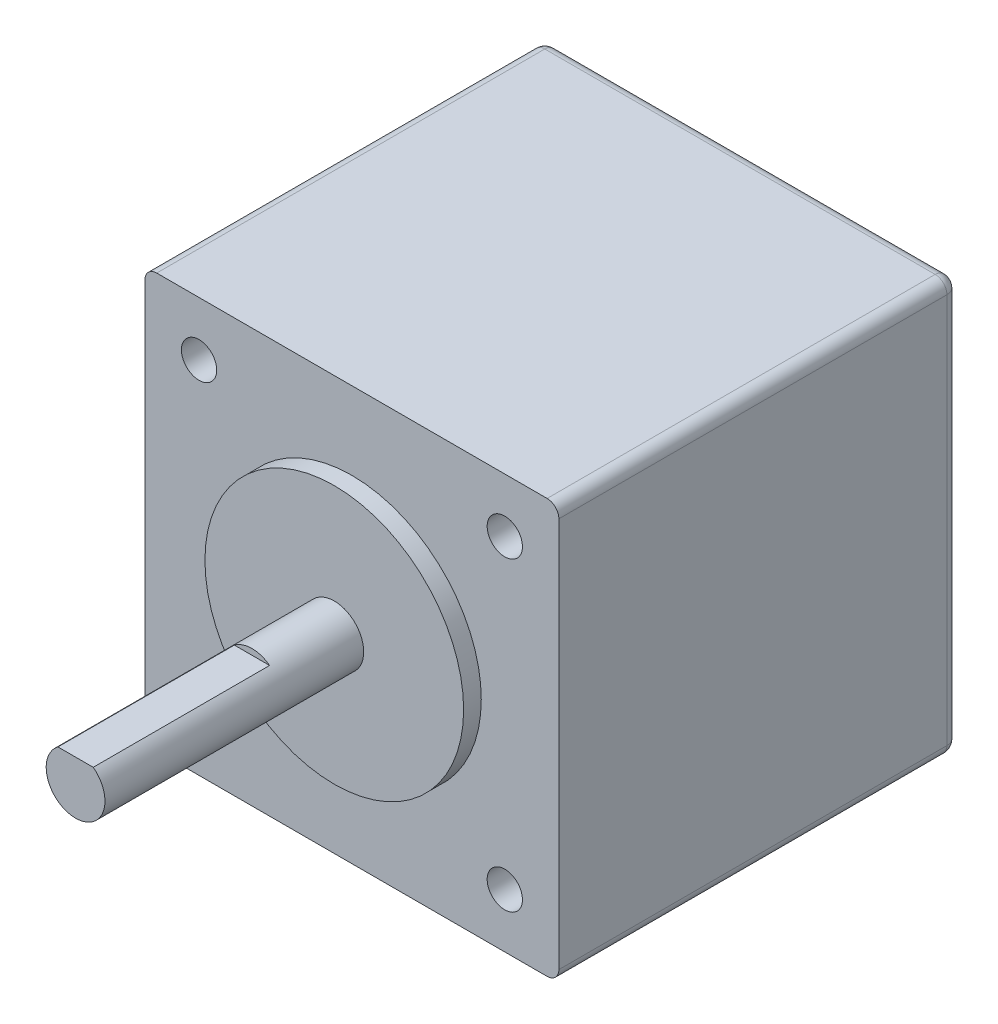
ISO-10303-21;
HEADER;
FILE_DESCRIPTION(('STEP AP214'),'2;1');
FILE_NAME('part.step','',(''),(''),'','','');
FILE_SCHEMA(('AUTOMOTIVE_DESIGN { 1 0 10303 214 1 1 1 1 }'));
ENDSEC;
DATA;
#1=APPLICATION_CONTEXT('core data for automotive mechanical design processes');
#2=APPLICATION_PROTOCOL_DEFINITION('international standard','automotive_design',2000,#1);
#3=PRODUCT_CONTEXT('',#1,'mechanical');
#4=PRODUCT('Part','Part','',(#3));
#5=PRODUCT_RELATED_PRODUCT_CATEGORY('part','',(#4));
#6=PRODUCT_DEFINITION_FORMATION('','',#4);
#7=PRODUCT_DEFINITION_CONTEXT('part definition',#1,'design');
#8=PRODUCT_DEFINITION('design','',#6,#7);
#9=PRODUCT_DEFINITION_SHAPE('','',#8);
#10=(LENGTH_UNIT() NAMED_UNIT(*) SI_UNIT(.MILLI.,.METRE.));
#11=(NAMED_UNIT(*) PLANE_ANGLE_UNIT() SI_UNIT($,.RADIAN.));
#12=(NAMED_UNIT(*) SI_UNIT($,.STERADIAN.) SOLID_ANGLE_UNIT());
#13=UNCERTAINTY_MEASURE_WITH_UNIT(LENGTH_MEASURE(1.E-05),#10,'distance_accuracy_value','');
#14=(GEOMETRIC_REPRESENTATION_CONTEXT(3) GLOBAL_UNCERTAINTY_ASSIGNED_CONTEXT((#13)) GLOBAL_UNIT_ASSIGNED_CONTEXT((#10,
#11,#12)) REPRESENTATION_CONTEXT('',''));
#15=CARTESIAN_POINT('',(0.,0.,0.));
#16=DIRECTION('',(0.,0.,1.));
#17=DIRECTION('',(1.,0.,0.));
#18=AXIS2_PLACEMENT_3D('',#15,#16,#17);
#19=CARTESIAN_POINT('',(0.,0.,35.5));
#20=DIRECTION('',(0.,0.,1.));
#21=DIRECTION('',(1.,0.,0.));
#22=AXIS2_PLACEMENT_3D('',#19,#20,#21);
#23=PLANE('',#22);
#24=CARTESIAN_POINT('',(0.,0.,35.5));
#25=DIRECTION('',(0.,0.,1.));
#26=DIRECTION('',(1.,0.,0.));
#27=AXIS2_PLACEMENT_3D('',#24,#25,#26);
#28=CIRCLE('',#27,11.);
#29=CARTESIAN_POINT('',(11.,0.,35.5));
#30=VERTEX_POINT('',#29);
#31=EDGE_CURVE('E144',#30,#30,#28,.T.);
#32=ORIENTED_EDGE('',*,*,#31,.T.);
#33=EDGE_LOOP('',(#32));
#34=FACE_BOUND('',#33,.T.);
#35=CARTESIAN_POINT('',(0.,0.,35.5));
#36=DIRECTION('',(0.,0.,1.));
#37=DIRECTION('',(1.,0.,0.));
#38=AXIS2_PLACEMENT_3D('',#35,#36,#37);
#39=CIRCLE('',#38,2.5);
#40=CARTESIAN_POINT('',(2.5,0.,35.5));
#41=VERTEX_POINT('',#40);
#42=EDGE_CURVE('E145',#41,#41,#39,.T.);
#43=ORIENTED_EDGE('',*,*,#42,.F.);
#44=EDGE_LOOP('',(#43));
#45=FACE_BOUND('',#44,.T.);
#46=ADVANCED_FACE('F33',(#34,#45),#23,.T.);
#47=CARTESIAN_POINT('',(17.6,17.6,34.));
#48=DIRECTION('',(0.,0.,-1.));
#49=DIRECTION('',(-1.,0.,0.));
#50=AXIS2_PLACEMENT_3D('',#47,#48,#49);
#51=PLANE('',#50);
#52=CARTESIAN_POINT('',(-12.9999999999997,-13.,34.));
#53=DIRECTION('',(0.,0.,1.));
#54=DIRECTION('',(1.,0.,0.));
#55=AXIS2_PLACEMENT_3D('',#52,#53,#54);
#56=CIRCLE('',#55,1.5);
#57=CARTESIAN_POINT('',(-11.4999999999997,-13.,34.));
#58=VERTEX_POINT('',#57);
#59=EDGE_CURVE('E237',#58,#58,#56,.T.);
#60=ORIENTED_EDGE('',*,*,#59,.F.);
#61=EDGE_LOOP('',(#60));
#62=FACE_BOUND('',#61,.T.);
#63=CARTESIAN_POINT('',(13.0000000000003,-12.9999999999997,34.));
#64=DIRECTION('',(0.,0.,1.));
#65=DIRECTION('',(1.,0.,0.));
#66=AXIS2_PLACEMENT_3D('',#63,#64,#65);
#67=CIRCLE('',#66,1.5);
#68=CARTESIAN_POINT('',(14.5000000000003,-12.9999999999997,34.));
#69=VERTEX_POINT('',#68);
#70=EDGE_CURVE('E245',#69,#69,#67,.T.);
#71=ORIENTED_EDGE('',*,*,#70,.F.);
#72=EDGE_LOOP('',(#71));
#73=FACE_BOUND('',#72,.T.);
#74=CARTESIAN_POINT('',(13.,13.0000000000003,34.));
#75=DIRECTION('',(0.,0.,1.));
#76=DIRECTION('',(1.,0.,0.));
#77=AXIS2_PLACEMENT_3D('',#74,#75,#76);
#78=CIRCLE('',#77,1.5);
#79=CARTESIAN_POINT('',(14.5,13.0000000000003,34.));
#80=VERTEX_POINT('',#79);
#81=EDGE_CURVE('E251',#80,#80,#78,.T.);
#82=ORIENTED_EDGE('',*,*,#81,.F.);
#83=EDGE_LOOP('',(#82));
#84=FACE_BOUND('',#83,.T.);
#85=CARTESIAN_POINT('',(-13.,13.,34.));
#86=DIRECTION('',(0.,0.,1.));
#87=DIRECTION('',(1.,0.,0.));
#88=AXIS2_PLACEMENT_3D('',#85,#86,#87);
#89=CIRCLE('',#88,1.5);
#90=CARTESIAN_POINT('',(-11.5,13.,34.));
#91=VERTEX_POINT('',#90);
#92=EDGE_CURVE('E257',#91,#91,#89,.T.);
#93=ORIENTED_EDGE('',*,*,#92,.F.);
#94=EDGE_LOOP('',(#93));
#95=FACE_BOUND('',#94,.T.);
#96=DIRECTION('',(0.,-1.,0.));
#97=VECTOR('',#96,1.);
#98=CARTESIAN_POINT('',(-17.6,-17.6,34.));
#99=LINE('',#98,#97);
#100=CARTESIAN_POINT('',(-17.6,16.6,34.));
#101=VERTEX_POINT('',#100);
#102=CARTESIAN_POINT('',(-17.6,-16.6,34.));
#103=VERTEX_POINT('',#102);
#104=EDGE_CURVE('E159',#101,#103,#99,.T.);
#105=ORIENTED_EDGE('',*,*,#104,.T.);
#106=CARTESIAN_POINT('',(-16.6,-16.6,34.));
#107=DIRECTION('',(0.,0.,-1.));
#108=DIRECTION('',(-1.,0.,0.));
#109=AXIS2_PLACEMENT_3D('',#106,#107,#108);
#110=CIRCLE('',#109,1.);
#111=CARTESIAN_POINT('',(-16.6,-17.6,34.));
#112=VERTEX_POINT('',#111);
#113=EDGE_CURVE('E11',#103,#112,#110,.F.);
#114=ORIENTED_EDGE('',*,*,#113,.T.);
#115=DIRECTION('',(1.,0.,0.));
#116=VECTOR('',#115,1.);
#117=CARTESIAN_POINT('',(-17.6,-17.6,34.));
#118=LINE('',#117,#116);
#119=CARTESIAN_POINT('',(16.6,-17.6,34.));
#120=VERTEX_POINT('',#119);
#121=EDGE_CURVE('E162',#112,#120,#118,.T.);
#122=ORIENTED_EDGE('',*,*,#121,.T.);
#123=CARTESIAN_POINT('',(16.6,-16.6,34.));
#124=DIRECTION('',(0.,0.,-1.));
#125=DIRECTION('',(-1.,0.,0.));
#126=AXIS2_PLACEMENT_3D('',#123,#124,#125);
#127=CIRCLE('',#126,1.);
#128=CARTESIAN_POINT('',(17.6,-16.6,34.));
#129=VERTEX_POINT('',#128);
#130=EDGE_CURVE('E42',#120,#129,#127,.F.);
#131=ORIENTED_EDGE('',*,*,#130,.T.);
#132=DIRECTION('',(0.,1.,0.));
#133=VECTOR('',#132,1.);
#134=CARTESIAN_POINT('',(17.6,-17.6,34.));
#135=LINE('',#134,#133);
#136=CARTESIAN_POINT('',(17.6,16.6,34.));
#137=VERTEX_POINT('',#136);
#138=EDGE_CURVE('E148',#129,#137,#135,.T.);
#139=ORIENTED_EDGE('',*,*,#138,.T.);
#140=CARTESIAN_POINT('',(16.6,16.6,34.));
#141=DIRECTION('',(0.,0.,-1.));
#142=DIRECTION('',(-1.,0.,0.));
#143=AXIS2_PLACEMENT_3D('',#140,#141,#142);
#144=CIRCLE('',#143,1.);
#145=CARTESIAN_POINT('',(16.6,17.6,34.));
#146=VERTEX_POINT('',#145);
#147=EDGE_CURVE('E200',#137,#146,#144,.F.);
#148=ORIENTED_EDGE('',*,*,#147,.T.);
#149=DIRECTION('',(-1.,0.,0.));
#150=VECTOR('',#149,1.);
#151=CARTESIAN_POINT('',(-17.6,17.6,34.));
#152=LINE('',#151,#150);
#153=CARTESIAN_POINT('',(-16.6,17.6,34.));
#154=VERTEX_POINT('',#153);
#155=EDGE_CURVE('E156',#146,#154,#152,.T.);
#156=ORIENTED_EDGE('',*,*,#155,.T.);
#157=CARTESIAN_POINT('',(-16.6,16.6,34.));
#158=DIRECTION('',(0.,0.,-1.));
#159=DIRECTION('',(-1.,0.,0.));
#160=AXIS2_PLACEMENT_3D('',#157,#158,#159);
#161=CIRCLE('',#160,1.);
#162=EDGE_CURVE('E202',#154,#101,#161,.F.);
#163=ORIENTED_EDGE('',*,*,#162,.T.);
#164=EDGE_LOOP('',(#105,#114,#122,#131,#139,#148,#156,#163));
#165=FACE_BOUND('',#164,.T.);
#166=CARTESIAN_POINT('',(0.,0.,34.));
#167=DIRECTION('',(0.,0.,-1.));
#168=DIRECTION('',(-1.,0.,0.));
#169=AXIS2_PLACEMENT_3D('',#166,#167,#168);
#170=CIRCLE('',#169,11.);
#171=CARTESIAN_POINT('',(-11.,0.,34.));
#172=VERTEX_POINT('',#171);
#173=EDGE_CURVE('E134',#172,#172,#170,.F.);
#174=ORIENTED_EDGE('',*,*,#173,.F.);
#175=EDGE_LOOP('',(#174));
#176=FACE_BOUND('',#175,.T.);
#177=ADVANCED_FACE('F278',(#62,#73,#84,#95,#165,#176),#51,.F.);
#178=CARTESIAN_POINT('',(17.6,-17.6,34.));
#179=DIRECTION('',(-1.,0.,0.));
#180=DIRECTION('',(0.,0.,1.));
#181=AXIS2_PLACEMENT_3D('',#178,#179,#180);
#182=PLANE('',#181);
#183=ORIENTED_EDGE('',*,*,#138,.F.);
#184=DIRECTION('',(0.,0.,-1.));
#185=VECTOR('',#184,1.);
#186=CARTESIAN_POINT('',(17.6,-16.6,34.));
#187=LINE('',#186,#185);
#188=CARTESIAN_POINT('',(17.6,-16.6,1.));
#189=VERTEX_POINT('',#188);
#190=EDGE_CURVE('E50',#129,#189,#187,.T.);
#191=ORIENTED_EDGE('',*,*,#190,.T.);
#192=DIRECTION('',(0.,1.,0.));
#193=VECTOR('',#192,1.);
#194=CARTESIAN_POINT('',(17.6,17.6,1.));
#195=LINE('',#194,#193);
#196=CARTESIAN_POINT('',(17.6,16.6,1.));
#197=VERTEX_POINT('',#196);
#198=EDGE_CURVE('E55',#189,#197,#195,.T.);
#199=ORIENTED_EDGE('',*,*,#198,.T.);
#200=DIRECTION('',(0.,0.,-1.));
#201=VECTOR('',#200,1.);
#202=CARTESIAN_POINT('',(17.6,16.6,34.));
#203=LINE('',#202,#201);
#204=EDGE_CURVE('E196',#197,#137,#203,.F.);
#205=ORIENTED_EDGE('',*,*,#204,.T.);
#206=EDGE_LOOP('',(#183,#191,#199,#205));
#207=FACE_BOUND('',#206,.T.);
#208=ADVANCED_FACE('F284',(#207),#182,.F.);
#209=CARTESIAN_POINT('',(-17.6,17.6,34.));
#210=DIRECTION('',(0.,-1.,0.));
#211=DIRECTION('',(0.,0.,-1.));
#212=AXIS2_PLACEMENT_3D('',#209,#210,#211);
#213=PLANE('',#212);
#214=DIRECTION('',(-1.,0.,0.));
#215=VECTOR('',#214,1.);
#216=CARTESIAN_POINT('',(-17.6,17.6,1.));
#217=LINE('',#216,#215);
#218=CARTESIAN_POINT('',(16.6,17.6,1.));
#219=VERTEX_POINT('',#218);
#220=CARTESIAN_POINT('',(-16.6,17.6,1.));
#221=VERTEX_POINT('',#220);
#222=EDGE_CURVE('E170',#219,#221,#217,.T.);
#223=ORIENTED_EDGE('',*,*,#222,.T.);
#224=DIRECTION('',(0.,0.,-1.));
#225=VECTOR('',#224,1.);
#226=CARTESIAN_POINT('',(-16.6,17.6,34.));
#227=LINE('',#226,#225);
#228=EDGE_CURVE('E173',#221,#154,#227,.F.);
#229=ORIENTED_EDGE('',*,*,#228,.T.);
#230=ORIENTED_EDGE('',*,*,#155,.F.);
#231=DIRECTION('',(0.,0.,-1.));
#232=VECTOR('',#231,1.);
#233=CARTESIAN_POINT('',(16.6,17.6,34.));
#234=LINE('',#233,#232);
#235=EDGE_CURVE('E168',#146,#219,#234,.T.);
#236=ORIENTED_EDGE('',*,*,#235,.T.);
#237=EDGE_LOOP('',(#223,#229,#230,#236));
#238=FACE_BOUND('',#237,.T.);
#239=ADVANCED_FACE('F305',(#238),#213,.F.);
#240=CARTESIAN_POINT('',(-17.6,-17.6,34.));
#241=DIRECTION('',(1.,0.,0.));
#242=DIRECTION('',(0.,0.,-1.));
#243=AXIS2_PLACEMENT_3D('',#240,#241,#242);
#244=PLANE('',#243);
#245=DIRECTION('',(0.,-1.,0.));
#246=VECTOR('',#245,1.);
#247=CARTESIAN_POINT('',(-17.6,-17.6,1.));
#248=LINE('',#247,#246);
#249=CARTESIAN_POINT('',(-17.6,16.6,1.));
#250=VERTEX_POINT('',#249);
#251=CARTESIAN_POINT('',(-17.6,-16.6,1.));
#252=VERTEX_POINT('',#251);
#253=EDGE_CURVE('E186',#250,#252,#248,.T.);
#254=ORIENTED_EDGE('',*,*,#253,.T.);
#255=DIRECTION('',(0.,0.,-1.));
#256=VECTOR('',#255,1.);
#257=CARTESIAN_POINT('',(-17.6,-16.6,34.));
#258=LINE('',#257,#256);
#259=EDGE_CURVE('E188',#252,#103,#258,.F.);
#260=ORIENTED_EDGE('',*,*,#259,.T.);
#261=ORIENTED_EDGE('',*,*,#104,.F.);
#262=DIRECTION('',(0.,0.,-1.));
#263=VECTOR('',#262,1.);
#264=CARTESIAN_POINT('',(-17.6,16.6,34.));
#265=LINE('',#264,#263);
#266=EDGE_CURVE('E184',#101,#250,#265,.T.);
#267=ORIENTED_EDGE('',*,*,#266,.T.);
#268=EDGE_LOOP('',(#254,#260,#261,#267));
#269=FACE_BOUND('',#268,.T.);
#270=ADVANCED_FACE('F301',(#269),#244,.F.);
#271=CARTESIAN_POINT('',(-17.6,-17.6,34.));
#272=DIRECTION('',(0.,1.,0.));
#273=DIRECTION('',(0.,0.,1.));
#274=AXIS2_PLACEMENT_3D('',#271,#272,#273);
#275=PLANE('',#274);
#276=ORIENTED_EDGE('',*,*,#121,.F.);
#277=DIRECTION('',(0.,0.,-1.));
#278=VECTOR('',#277,1.);
#279=CARTESIAN_POINT('',(-16.6,-17.6,34.));
#280=LINE('',#279,#278);
#281=CARTESIAN_POINT('',(-16.6,-17.6,1.));
#282=VERTEX_POINT('',#281);
#283=EDGE_CURVE('E194',#112,#282,#280,.T.);
#284=ORIENTED_EDGE('',*,*,#283,.T.);
#285=DIRECTION('',(1.,0.,0.));
#286=VECTOR('',#285,1.);
#287=CARTESIAN_POINT('',(17.6,-17.6,1.));
#288=LINE('',#287,#286);
#289=CARTESIAN_POINT('',(16.6,-17.6,1.));
#290=VERTEX_POINT('',#289);
#291=EDGE_CURVE('E192',#282,#290,#288,.T.);
#292=ORIENTED_EDGE('',*,*,#291,.T.);
#293=DIRECTION('',(0.,0.,-1.));
#294=VECTOR('',#293,1.);
#295=CARTESIAN_POINT('',(16.6,-17.6,34.));
#296=LINE('',#295,#294);
#297=EDGE_CURVE('E190',#290,#120,#296,.F.);
#298=ORIENTED_EDGE('',*,*,#297,.T.);
#299=EDGE_LOOP('',(#276,#284,#292,#298));
#300=FACE_BOUND('',#299,.T.);
#301=ADVANCED_FACE('F297',(#300),#275,.F.);
#302=CARTESIAN_POINT('',(17.6,17.6,0.));
#303=DIRECTION('',(0.,0.,-1.));
#304=DIRECTION('',(-1.,0.,0.));
#305=AXIS2_PLACEMENT_3D('',#302,#303,#304);
#306=PLANE('',#305);
#307=DIRECTION('',(0.,-1.,0.));
#308=VECTOR('',#307,1.);
#309=CARTESIAN_POINT('',(-16.6,17.6,0.));
#310=LINE('',#309,#308);
#311=CARTESIAN_POINT('',(-16.6,-16.6,0.));
#312=VERTEX_POINT('',#311);
#313=CARTESIAN_POINT('',(-16.6,16.6,0.));
#314=VERTEX_POINT('',#313);
#315=EDGE_CURVE('E179',#312,#314,#310,.F.);
#316=ORIENTED_EDGE('',*,*,#315,.T.);
#317=DIRECTION('',(-1.,0.,0.));
#318=VECTOR('',#317,1.);
#319=CARTESIAN_POINT('',(17.6,16.6,0.));
#320=LINE('',#319,#318);
#321=CARTESIAN_POINT('',(16.6,16.6,0.));
#322=VERTEX_POINT('',#321);
#323=EDGE_CURVE('E181',#314,#322,#320,.F.);
#324=ORIENTED_EDGE('',*,*,#323,.T.);
#325=DIRECTION('',(0.,1.,0.));
#326=VECTOR('',#325,1.);
#327=CARTESIAN_POINT('',(16.6,-17.6,0.));
#328=LINE('',#327,#326);
#329=CARTESIAN_POINT('',(16.6,-16.6,0.));
#330=VERTEX_POINT('',#329);
#331=EDGE_CURVE('E175',#322,#330,#328,.F.);
#332=ORIENTED_EDGE('',*,*,#331,.T.);
#333=DIRECTION('',(1.,0.,0.));
#334=VECTOR('',#333,1.);
#335=CARTESIAN_POINT('',(-17.6,-16.6,0.));
#336=LINE('',#335,#334);
#337=EDGE_CURVE('E177',#330,#312,#336,.F.);
#338=ORIENTED_EDGE('',*,*,#337,.T.);
#339=EDGE_LOOP('',(#316,#324,#332,#338));
#340=FACE_BOUND('',#339,.T.);
#341=ADVANCED_FACE('F292',(#340),#306,.T.);
#342=CARTESIAN_POINT('',(0.,0.,35.5));
#343=DIRECTION('',(0.,0.,-1.));
#344=DIRECTION('',(-1.,0.,0.));
#345=AXIS2_PLACEMENT_3D('',#342,#343,#344);
#346=CYLINDRICAL_SURFACE('',#345,11.);
#347=ORIENTED_EDGE('',*,*,#31,.F.);
#348=EDGE_LOOP('',(#347));
#349=FACE_BOUND('',#348,.T.);
#350=ORIENTED_EDGE('',*,*,#173,.T.);
#351=EDGE_LOOP('',(#350));
#352=FACE_BOUND('',#351,.T.);
#353=ADVANCED_FACE('F290',(#349,#352),#346,.T.);
#354=CARTESIAN_POINT('',(0.,0.,57.5));
#355=DIRECTION('',(0.,0.,-1.));
#356=DIRECTION('',(-1.,0.,0.));
#357=AXIS2_PLACEMENT_3D('',#354,#355,#356);
#358=CYLINDRICAL_SURFACE('',#357,2.5);
#359=CARTESIAN_POINT('',(0.,0.,57.5));
#360=DIRECTION('',(0.,0.,1.));
#361=DIRECTION('',(1.,0.,0.));
#362=AXIS2_PLACEMENT_3D('',#359,#360,#361);
#363=CIRCLE('',#362,2.5);
#364=CARTESIAN_POINT('',(-1.5,2.,57.5));
#365=VERTEX_POINT('',#364);
#366=CARTESIAN_POINT('',(1.5,2.,57.5));
#367=VERTEX_POINT('',#366);
#368=EDGE_CURVE('E140',#365,#367,#363,.T.);
#369=ORIENTED_EDGE('',*,*,#368,.F.);
#370=DIRECTION('',(0.,0.,-1.));
#371=VECTOR('',#370,1.);
#372=CARTESIAN_POINT('',(-1.5,2.,57.5));
#373=LINE('',#372,#371);
#374=CARTESIAN_POINT('',(-1.5,2.,42.5));
#375=VERTEX_POINT('',#374);
#376=EDGE_CURVE('E129',#365,#375,#373,.T.);
#377=ORIENTED_EDGE('',*,*,#376,.T.);
#378=CARTESIAN_POINT('',(0.,0.,42.5));
#379=DIRECTION('',(0.,0.,-1.));
#380=DIRECTION('',(-1.,0.,0.));
#381=AXIS2_PLACEMENT_3D('',#378,#379,#380);
#382=CIRCLE('',#381,2.5);
#383=CARTESIAN_POINT('',(1.5,2.,42.5));
#384=VERTEX_POINT('',#383);
#385=EDGE_CURVE('E133',#375,#384,#382,.T.);
#386=ORIENTED_EDGE('',*,*,#385,.T.);
#387=DIRECTION('',(0.,0.,-1.));
#388=VECTOR('',#387,1.);
#389=CARTESIAN_POINT('',(1.5,2.,57.5));
#390=LINE('',#389,#388);
#391=EDGE_CURVE('E126',#384,#367,#390,.F.);
#392=ORIENTED_EDGE('',*,*,#391,.T.);
#393=EDGE_LOOP('',(#369,#377,#386,#392));
#394=FACE_BOUND('',#393,.T.);
#395=ORIENTED_EDGE('',*,*,#42,.T.);
#396=EDGE_LOOP('',(#395));
#397=FACE_BOUND('',#396,.T.);
#398=ADVANCED_FACE('F138',(#394,#397),#358,.T.);
#399=CARTESIAN_POINT('',(0.,0.,57.5));
#400=DIRECTION('',(0.,0.,1.));
#401=DIRECTION('',(1.,0.,0.));
#402=AXIS2_PLACEMENT_3D('',#399,#400,#401);
#403=PLANE('',#402);
#404=DIRECTION('',(1.,0.,0.));
#405=VECTOR('',#404,1.);
#406=CARTESIAN_POINT('',(0.,2.,57.5));
#407=LINE('',#406,#405);
#408=EDGE_CURVE('E122',#365,#367,#407,.T.);
#409=ORIENTED_EDGE('',*,*,#408,.F.);
#410=ORIENTED_EDGE('',*,*,#368,.T.);
#411=EDGE_LOOP('',(#409,#410));
#412=FACE_BOUND('',#411,.T.);
#413=ADVANCED_FACE('F143',(#412),#403,.T.);
#414=CARTESIAN_POINT('',(-5.,2.5,42.5));
#415=DIRECTION('',(0.,0.,-1.));
#416=DIRECTION('',(-1.,0.,0.));
#417=AXIS2_PLACEMENT_3D('',#414,#415,#416);
#418=PLANE('',#417);
#419=DIRECTION('',(1.,0.,0.));
#420=VECTOR('',#419,1.);
#421=CARTESIAN_POINT('',(-5.,2.,42.5));
#422=LINE('',#421,#420);
#423=EDGE_CURVE('E141',#375,#384,#422,.T.);
#424=ORIENTED_EDGE('',*,*,#423,.T.);
#425=ORIENTED_EDGE('',*,*,#385,.F.);
#426=EDGE_LOOP('',(#424,#425));
#427=FACE_BOUND('',#426,.T.);
#428=ADVANCED_FACE('F266',(#427),#418,.F.);
#429=CARTESIAN_POINT('',(-5.,2.,57.5));
#430=DIRECTION('',(0.,-1.,0.));
#431=DIRECTION('',(0.,0.,-1.));
#432=AXIS2_PLACEMENT_3D('',#429,#430,#431);
#433=PLANE('',#432);
#434=ORIENTED_EDGE('',*,*,#408,.T.);
#435=ORIENTED_EDGE('',*,*,#391,.F.);
#436=ORIENTED_EDGE('',*,*,#423,.F.);
#437=ORIENTED_EDGE('',*,*,#376,.F.);
#438=EDGE_LOOP('',(#434,#435,#436,#437));
#439=FACE_BOUND('',#438,.T.);
#440=ADVANCED_FACE('F124',(#439),#433,.F.);
#441=CARTESIAN_POINT('',(-13.,13.,29.5));
#442=DIRECTION('',(0.,0.,1.));
#443=DIRECTION('',(1.,0.,0.));
#444=AXIS2_PLACEMENT_3D('',#441,#442,#443);
#445=CYLINDRICAL_SURFACE('',#444,1.5);
#446=CARTESIAN_POINT('',(-13.,13.,29.5));
#447=DIRECTION('',(0.,0.,1.));
#448=DIRECTION('',(1.,0.,0.));
#449=AXIS2_PLACEMENT_3D('',#446,#447,#448);
#450=CIRCLE('',#449,1.5);
#451=CARTESIAN_POINT('',(-11.5,13.,29.5));
#452=VERTEX_POINT('',#451);
#453=EDGE_CURVE('E260',#452,#452,#450,.T.);
#454=ORIENTED_EDGE('',*,*,#453,.F.);
#455=EDGE_LOOP('',(#454));
#456=FACE_BOUND('',#455,.T.);
#457=ORIENTED_EDGE('',*,*,#92,.T.);
#458=EDGE_LOOP('',(#457));
#459=FACE_BOUND('',#458,.T.);
#460=ADVANCED_FACE('F273',(#456,#459),#445,.F.);
#461=CARTESIAN_POINT('',(-13.,13.,29.5));
#462=DIRECTION('',(0.,0.,1.));
#463=DIRECTION('',(1.,0.,0.));
#464=AXIS2_PLACEMENT_3D('',#461,#462,#463);
#465=PLANE('',#464);
#466=ORIENTED_EDGE('',*,*,#453,.T.);
#467=EDGE_LOOP('',(#466));
#468=FACE_BOUND('',#467,.T.);
#469=ADVANCED_FACE('F418',(#468),#465,.T.);
#470=CARTESIAN_POINT('',(13.,13.0000000000003,29.5));
#471=DIRECTION('',(0.,0.,1.));
#472=DIRECTION('',(1.,0.,0.));
#473=AXIS2_PLACEMENT_3D('',#470,#471,#472);
#474=CYLINDRICAL_SURFACE('',#473,1.5);
#475=CARTESIAN_POINT('',(13.,13.0000000000003,29.5));
#476=DIRECTION('',(0.,0.,1.));
#477=DIRECTION('',(1.,0.,0.));
#478=AXIS2_PLACEMENT_3D('',#475,#476,#477);
#479=CIRCLE('',#478,1.5);
#480=CARTESIAN_POINT('',(14.5,13.0000000000003,29.5));
#481=VERTEX_POINT('',#480);
#482=EDGE_CURVE('E254',#481,#481,#479,.T.);
#483=ORIENTED_EDGE('',*,*,#482,.F.);
#484=EDGE_LOOP('',(#483));
#485=FACE_BOUND('',#484,.T.);
#486=ORIENTED_EDGE('',*,*,#81,.T.);
#487=EDGE_LOOP('',(#486));
#488=FACE_BOUND('',#487,.T.);
#489=ADVANCED_FACE('F414',(#485,#488),#474,.F.);
#490=CARTESIAN_POINT('',(13.,13.0000000000003,29.5));
#491=DIRECTION('',(0.,0.,1.));
#492=DIRECTION('',(1.,0.,0.));
#493=AXIS2_PLACEMENT_3D('',#490,#491,#492);
#494=PLANE('',#493);
#495=ORIENTED_EDGE('',*,*,#482,.T.);
#496=EDGE_LOOP('',(#495));
#497=FACE_BOUND('',#496,.T.);
#498=ADVANCED_FACE('F410',(#497),#494,.T.);
#499=CARTESIAN_POINT('',(13.0000000000003,-12.9999999999997,29.5));
#500=DIRECTION('',(0.,0.,1.));
#501=DIRECTION('',(1.,0.,0.));
#502=AXIS2_PLACEMENT_3D('',#499,#500,#501);
#503=CYLINDRICAL_SURFACE('',#502,1.5);
#504=CARTESIAN_POINT('',(13.0000000000003,-12.9999999999997,29.5));
#505=DIRECTION('',(0.,0.,1.));
#506=DIRECTION('',(1.,0.,0.));
#507=AXIS2_PLACEMENT_3D('',#504,#505,#506);
#508=CIRCLE('',#507,1.5);
#509=CARTESIAN_POINT('',(14.5000000000003,-12.9999999999997,29.5));
#510=VERTEX_POINT('',#509);
#511=EDGE_CURVE('E248',#510,#510,#508,.T.);
#512=ORIENTED_EDGE('',*,*,#511,.F.);
#513=EDGE_LOOP('',(#512));
#514=FACE_BOUND('',#513,.T.);
#515=ORIENTED_EDGE('',*,*,#70,.T.);
#516=EDGE_LOOP('',(#515));
#517=FACE_BOUND('',#516,.T.);
#518=ADVANCED_FACE('F406',(#514,#517),#503,.F.);
#519=CARTESIAN_POINT('',(13.0000000000003,-12.9999999999997,29.5));
#520=DIRECTION('',(0.,0.,1.));
#521=DIRECTION('',(1.,0.,0.));
#522=AXIS2_PLACEMENT_3D('',#519,#520,#521);
#523=PLANE('',#522);
#524=ORIENTED_EDGE('',*,*,#511,.T.);
#525=EDGE_LOOP('',(#524));
#526=FACE_BOUND('',#525,.T.);
#527=ADVANCED_FACE('F400',(#526),#523,.T.);
#528=CARTESIAN_POINT('',(-12.9999999999997,-13.,29.5));
#529=DIRECTION('',(0.,0.,1.));
#530=DIRECTION('',(1.,0.,0.));
#531=AXIS2_PLACEMENT_3D('',#528,#529,#530);
#532=CYLINDRICAL_SURFACE('',#531,1.5);
#533=CARTESIAN_POINT('',(-12.9999999999997,-13.,29.5));
#534=DIRECTION('',(0.,0.,1.));
#535=DIRECTION('',(1.,0.,0.));
#536=AXIS2_PLACEMENT_3D('',#533,#534,#535);
#537=CIRCLE('',#536,1.5);
#538=CARTESIAN_POINT('',(-11.4999999999997,-13.,29.5));
#539=VERTEX_POINT('',#538);
#540=EDGE_CURVE('E240',#539,#539,#537,.T.);
#541=ORIENTED_EDGE('',*,*,#540,.F.);
#542=EDGE_LOOP('',(#541));
#543=FACE_BOUND('',#542,.T.);
#544=ORIENTED_EDGE('',*,*,#59,.T.);
#545=EDGE_LOOP('',(#544));
#546=FACE_BOUND('',#545,.T.);
#547=ADVANCED_FACE('F394',(#543,#546),#532,.F.);
#548=CARTESIAN_POINT('',(-12.9999999999997,-13.,29.5));
#549=DIRECTION('',(0.,0.,1.));
#550=DIRECTION('',(1.,0.,0.));
#551=AXIS2_PLACEMENT_3D('',#548,#549,#550);
#552=PLANE('',#551);
#553=ORIENTED_EDGE('',*,*,#540,.T.);
#554=EDGE_LOOP('',(#553));
#555=FACE_BOUND('',#554,.T.);
#556=ADVANCED_FACE('F356',(#555),#552,.T.);
#557=CARTESIAN_POINT('',(16.6,-16.6,34.));
#558=DIRECTION('',(0.,0.,-1.));
#559=DIRECTION('',(-1.,0.,0.));
#560=AXIS2_PLACEMENT_3D('',#557,#558,#559);
#561=CYLINDRICAL_SURFACE('',#560,1.);
#562=ORIENTED_EDGE('',*,*,#130,.F.);
#563=ORIENTED_EDGE('',*,*,#297,.F.);
#564=CARTESIAN_POINT('',(16.6,-16.6,1.));
#565=DIRECTION('',(0.,0.,-1.));
#566=DIRECTION('',(-1.,0.,0.));
#567=AXIS2_PLACEMENT_3D('',#564,#565,#566);
#568=CIRCLE('',#567,1.);
#569=EDGE_CURVE('E232',#189,#290,#568,.T.);
#570=ORIENTED_EDGE('',*,*,#569,.F.);
#571=ORIENTED_EDGE('',*,*,#190,.F.);
#572=EDGE_LOOP('',(#562,#563,#570,#571));
#573=FACE_BOUND('',#572,.T.);
#574=ADVANCED_FACE('F35',(#573),#561,.T.);
#575=CARTESIAN_POINT('',(-16.6,-16.6,34.));
#576=DIRECTION('',(0.,0.,-1.));
#577=DIRECTION('',(-1.,0.,0.));
#578=AXIS2_PLACEMENT_3D('',#575,#576,#577);
#579=CYLINDRICAL_SURFACE('',#578,1.);
#580=ORIENTED_EDGE('',*,*,#113,.F.);
#581=ORIENTED_EDGE('',*,*,#259,.F.);
#582=CARTESIAN_POINT('',(-16.6,-16.6,1.));
#583=DIRECTION('',(0.,0.,-1.));
#584=DIRECTION('',(-1.,0.,0.));
#585=AXIS2_PLACEMENT_3D('',#582,#583,#584);
#586=CIRCLE('',#585,1.);
#587=EDGE_CURVE('E230',#282,#252,#586,.T.);
#588=ORIENTED_EDGE('',*,*,#587,.F.);
#589=ORIENTED_EDGE('',*,*,#283,.F.);
#590=EDGE_LOOP('',(#580,#581,#588,#589));
#591=FACE_BOUND('',#590,.T.);
#592=ADVANCED_FACE('F349',(#591),#579,.T.);
#593=CARTESIAN_POINT('',(-17.6,-16.6,1.));
#594=DIRECTION('',(-1.,0.,0.));
#595=DIRECTION('',(0.,0.,1.));
#596=AXIS2_PLACEMENT_3D('',#593,#594,#595);
#597=CYLINDRICAL_SURFACE('',#596,1.);
#598=CARTESIAN_POINT('',(16.6,-16.6,1.));
#599=DIRECTION('',(1.,0.,0.));
#600=DIRECTION('',(0.,0.,-1.));
#601=AXIS2_PLACEMENT_3D('',#598,#599,#600);
#602=CIRCLE('',#601,1.);
#603=EDGE_CURVE('E37',#290,#330,#602,.T.);
#604=ORIENTED_EDGE('',*,*,#603,.F.);
#605=ORIENTED_EDGE('',*,*,#291,.F.);
#606=CARTESIAN_POINT('',(-16.6,-16.6,1.));
#607=DIRECTION('',(-1.,0.,0.));
#608=DIRECTION('',(0.,0.,1.));
#609=AXIS2_PLACEMENT_3D('',#606,#607,#608);
#610=CIRCLE('',#609,1.);
#611=EDGE_CURVE('E227',#312,#282,#610,.T.);
#612=ORIENTED_EDGE('',*,*,#611,.F.);
#613=ORIENTED_EDGE('',*,*,#337,.F.);
#614=EDGE_LOOP('',(#604,#605,#612,#613));
#615=FACE_BOUND('',#614,.T.);
#616=ADVANCED_FACE('F347',(#615),#597,.T.);
#617=CARTESIAN_POINT('',(16.6,-16.6,1.));
#618=DIRECTION('',(0.,0.,1.));
#619=DIRECTION('',(1.,0.,0.));
#620=AXIS2_PLACEMENT_3D('',#617,#618,#619);
#621=SPHERICAL_SURFACE('',#620,1.);
#622=ORIENTED_EDGE('',*,*,#569,.T.);
#623=ORIENTED_EDGE('',*,*,#603,.T.);
#624=CARTESIAN_POINT('',(16.6,-16.6,1.));
#625=DIRECTION('',(0.,-1.,0.));
#626=DIRECTION('',(0.,0.,-1.));
#627=AXIS2_PLACEMENT_3D('',#624,#625,#626);
#628=CIRCLE('',#627,1.);
#629=EDGE_CURVE('E224',#189,#330,#628,.F.);
#630=ORIENTED_EDGE('',*,*,#629,.F.);
#631=EDGE_LOOP('',(#622,#623,#630));
#632=FACE_BOUND('',#631,.T.);
#633=ADVANCED_FACE('F343',(#632),#621,.T.);
#634=CARTESIAN_POINT('',(-16.6,-16.6,1.));
#635=DIRECTION('',(0.,0.,1.));
#636=DIRECTION('',(1.,0.,0.));
#637=AXIS2_PLACEMENT_3D('',#634,#635,#636);
#638=SPHERICAL_SURFACE('',#637,1.);
#639=ORIENTED_EDGE('',*,*,#611,.T.);
#640=ORIENTED_EDGE('',*,*,#587,.T.);
#641=CARTESIAN_POINT('',(-16.6,-16.6,1.));
#642=DIRECTION('',(0.,-1.,0.));
#643=DIRECTION('',(0.,0.,-1.));
#644=AXIS2_PLACEMENT_3D('',#641,#642,#643);
#645=CIRCLE('',#644,1.);
#646=EDGE_CURVE('E221',#312,#252,#645,.F.);
#647=ORIENTED_EDGE('',*,*,#646,.F.);
#648=EDGE_LOOP('',(#639,#640,#647));
#649=FACE_BOUND('',#648,.T.);
#650=ADVANCED_FACE('F339',(#649),#638,.T.);
#651=CARTESIAN_POINT('',(16.6,-17.6,1.));
#652=DIRECTION('',(0.,-1.,0.));
#653=DIRECTION('',(0.,0.,-1.));
#654=AXIS2_PLACEMENT_3D('',#651,#652,#653);
#655=CYLINDRICAL_SURFACE('',#654,1.);
#656=ORIENTED_EDGE('',*,*,#629,.T.);
#657=ORIENTED_EDGE('',*,*,#331,.F.);
#658=CARTESIAN_POINT('',(16.6,16.6,1.));
#659=DIRECTION('',(0.,1.,0.));
#660=DIRECTION('',(0.,0.,1.));
#661=AXIS2_PLACEMENT_3D('',#658,#659,#660);
#662=CIRCLE('',#661,1.);
#663=EDGE_CURVE('E218',#197,#322,#662,.T.);
#664=ORIENTED_EDGE('',*,*,#663,.F.);
#665=ORIENTED_EDGE('',*,*,#198,.F.);
#666=EDGE_LOOP('',(#656,#657,#664,#665));
#667=FACE_BOUND('',#666,.T.);
#668=ADVANCED_FACE('F335',(#667),#655,.T.);
#669=CARTESIAN_POINT('',(16.6,16.6,34.));
#670=DIRECTION('',(0.,0.,-1.));
#671=DIRECTION('',(-1.,0.,0.));
#672=AXIS2_PLACEMENT_3D('',#669,#670,#671);
#673=CYLINDRICAL_SURFACE('',#672,1.);
#674=ORIENTED_EDGE('',*,*,#147,.F.);
#675=ORIENTED_EDGE('',*,*,#204,.F.);
#676=CARTESIAN_POINT('',(16.6,16.6,1.));
#677=DIRECTION('',(0.,0.,-1.));
#678=DIRECTION('',(-1.,0.,0.));
#679=AXIS2_PLACEMENT_3D('',#676,#677,#678);
#680=CIRCLE('',#679,1.);
#681=EDGE_CURVE('E215',#219,#197,#680,.T.);
#682=ORIENTED_EDGE('',*,*,#681,.F.);
#683=ORIENTED_EDGE('',*,*,#235,.F.);
#684=EDGE_LOOP('',(#674,#675,#682,#683));
#685=FACE_BOUND('',#684,.T.);
#686=ADVANCED_FACE('F331',(#685),#673,.T.);
#687=CARTESIAN_POINT('',(-16.6,16.6,34.));
#688=DIRECTION('',(0.,0.,-1.));
#689=DIRECTION('',(-1.,0.,0.));
#690=AXIS2_PLACEMENT_3D('',#687,#688,#689);
#691=CYLINDRICAL_SURFACE('',#690,1.);
#692=ORIENTED_EDGE('',*,*,#162,.F.);
#693=ORIENTED_EDGE('',*,*,#228,.F.);
#694=CARTESIAN_POINT('',(-16.6,16.6,1.));
#695=DIRECTION('',(0.,0.,-1.));
#696=DIRECTION('',(-1.,0.,0.));
#697=AXIS2_PLACEMENT_3D('',#694,#695,#696);
#698=CIRCLE('',#697,1.);
#699=EDGE_CURVE('E212',#250,#221,#698,.T.);
#700=ORIENTED_EDGE('',*,*,#699,.F.);
#701=ORIENTED_EDGE('',*,*,#266,.F.);
#702=EDGE_LOOP('',(#692,#693,#700,#701));
#703=FACE_BOUND('',#702,.T.);
#704=ADVANCED_FACE('F327',(#703),#691,.T.);
#705=CARTESIAN_POINT('',(-16.6,-17.6,1.));
#706=DIRECTION('',(0.,1.,0.));
#707=DIRECTION('',(0.,0.,1.));
#708=AXIS2_PLACEMENT_3D('',#705,#706,#707);
#709=CYLINDRICAL_SURFACE('',#708,1.);
#710=ORIENTED_EDGE('',*,*,#646,.T.);
#711=ORIENTED_EDGE('',*,*,#253,.F.);
#712=CARTESIAN_POINT('',(-16.6,16.6,1.));
#713=DIRECTION('',(0.,1.,0.));
#714=DIRECTION('',(0.,0.,1.));
#715=AXIS2_PLACEMENT_3D('',#712,#713,#714);
#716=CIRCLE('',#715,1.);
#717=EDGE_CURVE('E209',#314,#250,#716,.T.);
#718=ORIENTED_EDGE('',*,*,#717,.F.);
#719=ORIENTED_EDGE('',*,*,#315,.F.);
#720=EDGE_LOOP('',(#710,#711,#718,#719));
#721=FACE_BOUND('',#720,.T.);
#722=ADVANCED_FACE('F323',(#721),#709,.T.);
#723=CARTESIAN_POINT('',(16.6,16.6,1.));
#724=DIRECTION('',(0.,0.,1.));
#725=DIRECTION('',(1.,0.,0.));
#726=AXIS2_PLACEMENT_3D('',#723,#724,#725);
#727=SPHERICAL_SURFACE('',#726,1.);
#728=ORIENTED_EDGE('',*,*,#681,.T.);
#729=ORIENTED_EDGE('',*,*,#663,.T.);
#730=CARTESIAN_POINT('',(16.6,16.6,1.));
#731=DIRECTION('',(1.,0.,0.));
#732=DIRECTION('',(0.,0.,-1.));
#733=AXIS2_PLACEMENT_3D('',#730,#731,#732);
#734=CIRCLE('',#733,1.);
#735=EDGE_CURVE('E207',#219,#322,#734,.F.);
#736=ORIENTED_EDGE('',*,*,#735,.F.);
#737=EDGE_LOOP('',(#728,#729,#736));
#738=FACE_BOUND('',#737,.T.);
#739=ADVANCED_FACE('F319',(#738),#727,.T.);
#740=CARTESIAN_POINT('',(-16.6,16.6,1.));
#741=DIRECTION('',(0.,0.,1.));
#742=DIRECTION('',(1.,0.,0.));
#743=AXIS2_PLACEMENT_3D('',#740,#741,#742);
#744=SPHERICAL_SURFACE('',#743,1.);
#745=ORIENTED_EDGE('',*,*,#717,.T.);
#746=ORIENTED_EDGE('',*,*,#699,.T.);
#747=CARTESIAN_POINT('',(-16.6,16.6,1.));
#748=DIRECTION('',(-1.,0.,0.));
#749=DIRECTION('',(0.,0.,1.));
#750=AXIS2_PLACEMENT_3D('',#747,#748,#749);
#751=CIRCLE('',#750,1.);
#752=EDGE_CURVE('E205',#314,#221,#751,.F.);
#753=ORIENTED_EDGE('',*,*,#752,.F.);
#754=EDGE_LOOP('',(#745,#746,#753));
#755=FACE_BOUND('',#754,.T.);
#756=ADVANCED_FACE('F315',(#755),#744,.T.);
#757=CARTESIAN_POINT('',(-17.6,16.6,1.));
#758=DIRECTION('',(1.,0.,0.));
#759=DIRECTION('',(0.,0.,-1.));
#760=AXIS2_PLACEMENT_3D('',#757,#758,#759);
#761=CYLINDRICAL_SURFACE('',#760,1.);
#762=ORIENTED_EDGE('',*,*,#735,.T.);
#763=ORIENTED_EDGE('',*,*,#323,.F.);
#764=ORIENTED_EDGE('',*,*,#752,.T.);
#765=ORIENTED_EDGE('',*,*,#222,.F.);
#766=EDGE_LOOP('',(#762,#763,#764,#765));
#767=FACE_BOUND('',#766,.T.);
#768=ADVANCED_FACE('F312',(#767),#761,.T.);
#769=CLOSED_SHELL('',(#46,#177,#208,#239,#270,#301,#341,#353,#398,#413,#428,#440,#460,#469,#489,
#498,#518,#527,#547,#556,#574,#592,#616,#633,#650,#668,#686,#704,#722,#739,#756,#768));
#770=MANIFOLD_SOLID_BREP('B2',#769);
#771=ADVANCED_BREP_SHAPE_REPRESENTATION('',(#18,#770),#14);
#772=SHAPE_DEFINITION_REPRESENTATION(#9,#771);
ENDSEC;
END-ISO-10303-21;
